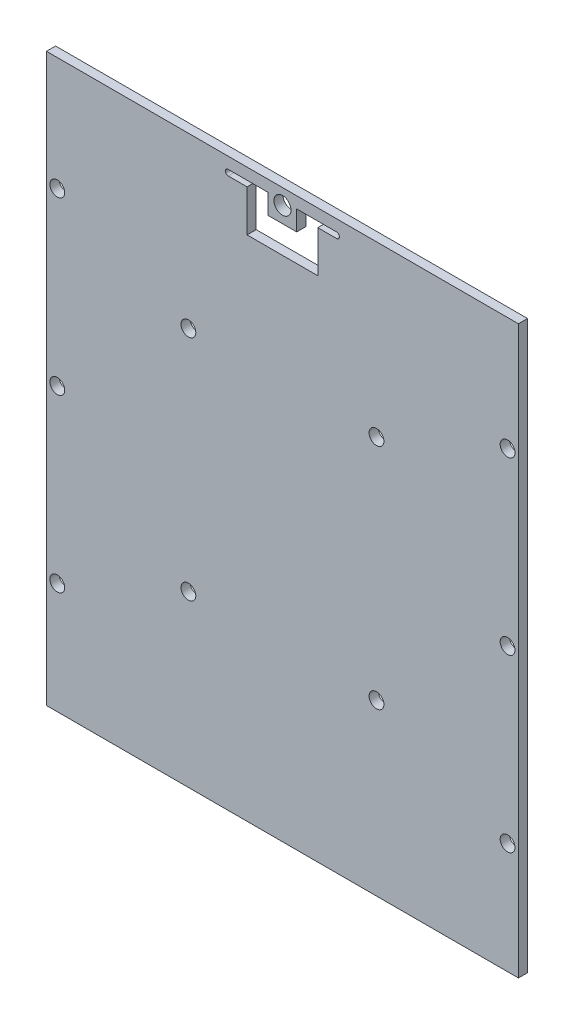
ISO-10303-21;
HEADER;
FILE_DESCRIPTION(('STEP AP214'),'2;1');
FILE_NAME('part.step','',(''),(''),'','','');
FILE_SCHEMA(('AUTOMOTIVE_DESIGN { 1 0 10303 214 1 1 1 1 }'));
ENDSEC;
DATA;
#1=APPLICATION_CONTEXT('core data for automotive mechanical design processes');
#2=APPLICATION_PROTOCOL_DEFINITION('international standard','automotive_design',2000,#1);
#3=PRODUCT_CONTEXT('',#1,'mechanical');
#4=PRODUCT('Part','Part','',(#3));
#5=PRODUCT_RELATED_PRODUCT_CATEGORY('part','',(#4));
#6=PRODUCT_DEFINITION_FORMATION('','',#4);
#7=PRODUCT_DEFINITION_CONTEXT('part definition',#1,'design');
#8=PRODUCT_DEFINITION('design','',#6,#7);
#9=PRODUCT_DEFINITION_SHAPE('','',#8);
#10=(LENGTH_UNIT() NAMED_UNIT(*) SI_UNIT(.MILLI.,.METRE.));
#11=(NAMED_UNIT(*) PLANE_ANGLE_UNIT() SI_UNIT($,.RADIAN.));
#12=(NAMED_UNIT(*) SI_UNIT($,.STERADIAN.) SOLID_ANGLE_UNIT());
#13=UNCERTAINTY_MEASURE_WITH_UNIT(LENGTH_MEASURE(1.E-05),#10,'distance_accuracy_value','');
#14=(GEOMETRIC_REPRESENTATION_CONTEXT(3) GLOBAL_UNCERTAINTY_ASSIGNED_CONTEXT((#13)) GLOBAL_UNIT_ASSIGNED_CONTEXT((#10,
#11,#12)) REPRESENTATION_CONTEXT('',''));
#15=CARTESIAN_POINT('',(0.,0.,0.));
#16=DIRECTION('',(0.,0.,1.));
#17=DIRECTION('',(1.,0.,0.));
#18=AXIS2_PLACEMENT_3D('',#15,#16,#17);
#19=CARTESIAN_POINT('',(0.,0.,1.6));
#20=DIRECTION('',(0.,0.,1.));
#21=DIRECTION('',(1.,0.,0.));
#22=AXIS2_PLACEMENT_3D('',#19,#20,#21);
#23=PLANE('',#22);
#24=CARTESIAN_POINT('',(-39.5,87.,1.6));
#25=DIRECTION('',(0.,0.,-1.));
#26=DIRECTION('',(-1.,0.,0.));
#27=AXIS2_PLACEMENT_3D('',#24,#25,#26);
#28=CIRCLE('',#27,1.3);
#29=CARTESIAN_POINT('',(-40.8,87.,1.6));
#30=VERTEX_POINT('',#29);
#31=EDGE_CURVE('E330',#30,#30,#28,.T.);
#32=ORIENTED_EDGE('',*,*,#31,.T.);
#33=EDGE_LOOP('',(#32));
#34=FACE_BOUND('',#33,.T.);
#35=CARTESIAN_POINT('',(39.5,87.,1.6));
#36=DIRECTION('',(0.,0.,-1.));
#37=DIRECTION('',(-1.,0.,0.));
#38=AXIS2_PLACEMENT_3D('',#35,#36,#37);
#39=CIRCLE('',#38,1.3);
#40=CARTESIAN_POINT('',(38.2,87.,1.6));
#41=VERTEX_POINT('',#40);
#42=EDGE_CURVE('E324',#41,#41,#39,.T.);
#43=ORIENTED_EDGE('',*,*,#42,.T.);
#44=EDGE_LOOP('',(#43));
#45=FACE_BOUND('',#44,.T.);
#46=DIRECTION('',(1.,0.,0.));
#47=VECTOR('',#46,1.);
#48=CARTESIAN_POINT('',(-6.2,96.6,1.6));
#49=LINE('',#48,#47);
#50=CARTESIAN_POINT('',(-6.2,96.6,1.6));
#51=VERTEX_POINT('',#50);
#52=CARTESIAN_POINT('',(6.2,96.6,1.6));
#53=VERTEX_POINT('',#52);
#54=EDGE_CURVE('E60',#51,#53,#49,.T.);
#55=ORIENTED_EDGE('',*,*,#54,.F.);
#56=DIRECTION('',(0.,-1.,0.));
#57=VECTOR('',#56,1.);
#58=CARTESIAN_POINT('',(-6.2,101.4,1.6));
#59=LINE('',#58,#57);
#60=CARTESIAN_POINT('',(-6.2,103.9,1.6));
#61=VERTEX_POINT('',#60);
#62=EDGE_CURVE('E216',#61,#51,#59,.T.);
#63=ORIENTED_EDGE('',*,*,#62,.F.);
#64=DIRECTION('',(1.,0.,0.));
#65=VECTOR('',#64,1.);
#66=CARTESIAN_POINT('',(-6.2,103.9,1.6));
#67=LINE('',#66,#65);
#68=CARTESIAN_POINT('',(-9.5,103.9,1.6));
#69=VERTEX_POINT('',#68);
#70=EDGE_CURVE('E219',#69,#61,#67,.T.);
#71=ORIENTED_EDGE('',*,*,#70,.F.);
#72=CARTESIAN_POINT('',(-9.5,104.4,1.6));
#73=DIRECTION('',(0.,0.,1.));
#74=DIRECTION('',(1.,0.,0.));
#75=AXIS2_PLACEMENT_3D('',#72,#73,#74);
#76=CIRCLE('',#75,0.5);
#77=CARTESIAN_POINT('',(-9.5,104.9,1.6));
#78=VERTEX_POINT('',#77);
#79=EDGE_CURVE('E222',#78,#69,#76,.T.);
#80=ORIENTED_EDGE('',*,*,#79,.F.);
#81=DIRECTION('',(-1.,0.,0.));
#82=VECTOR('',#81,1.);
#83=CARTESIAN_POINT('',(-9.5,104.9,1.6));
#84=LINE('',#83,#82);
#85=CARTESIAN_POINT('',(-2.5,104.9,1.6));
#86=VERTEX_POINT('',#85);
#87=EDGE_CURVE('E225',#86,#78,#84,.T.);
#88=ORIENTED_EDGE('',*,*,#87,.F.);
#89=DIRECTION('',(0.,1.,0.));
#90=VECTOR('',#89,1.);
#91=CARTESIAN_POINT('',(-2.5,104.9,1.6));
#92=LINE('',#91,#90);
#93=CARTESIAN_POINT('',(-2.5,101.4,1.6));
#94=VERTEX_POINT('',#93);
#95=EDGE_CURVE('E228',#94,#86,#92,.T.);
#96=ORIENTED_EDGE('',*,*,#95,.F.);
#97=DIRECTION('',(-1.,0.,0.));
#98=VECTOR('',#97,1.);
#99=CARTESIAN_POINT('',(-2.5,101.4,1.6));
#100=LINE('',#99,#98);
#101=CARTESIAN_POINT('',(2.5,101.4,1.6));
#102=VERTEX_POINT('',#101);
#103=EDGE_CURVE('E231',#102,#94,#100,.T.);
#104=ORIENTED_EDGE('',*,*,#103,.F.);
#105=DIRECTION('',(0.,-1.,0.));
#106=VECTOR('',#105,1.);
#107=CARTESIAN_POINT('',(2.5,101.4,1.6));
#108=LINE('',#107,#106);
#109=CARTESIAN_POINT('',(2.5,104.9,1.6));
#110=VERTEX_POINT('',#109);
#111=EDGE_CURVE('E234',#110,#102,#108,.T.);
#112=ORIENTED_EDGE('',*,*,#111,.F.);
#113=DIRECTION('',(-1.,0.,0.));
#114=VECTOR('',#113,1.);
#115=CARTESIAN_POINT('',(2.5,104.9,1.6));
#116=LINE('',#115,#114);
#117=CARTESIAN_POINT('',(9.5,104.9,1.6));
#118=VERTEX_POINT('',#117);
#119=EDGE_CURVE('E237',#118,#110,#116,.T.);
#120=ORIENTED_EDGE('',*,*,#119,.F.);
#121=CARTESIAN_POINT('',(9.5,104.4,1.6));
#122=DIRECTION('',(0.,0.,1.));
#123=DIRECTION('',(1.,0.,0.));
#124=AXIS2_PLACEMENT_3D('',#121,#122,#123);
#125=CIRCLE('',#124,0.5);
#126=CARTESIAN_POINT('',(9.5,103.9,1.6));
#127=VERTEX_POINT('',#126);
#128=EDGE_CURVE('E240',#127,#118,#125,.T.);
#129=ORIENTED_EDGE('',*,*,#128,.F.);
#130=DIRECTION('',(1.,0.,0.));
#131=VECTOR('',#130,1.);
#132=CARTESIAN_POINT('',(9.5,103.9,1.6));
#133=LINE('',#132,#131);
#134=CARTESIAN_POINT('',(6.2,103.9,1.6));
#135=VERTEX_POINT('',#134);
#136=EDGE_CURVE('E243',#135,#127,#133,.T.);
#137=ORIENTED_EDGE('',*,*,#136,.F.);
#138=DIRECTION('',(0.,1.,0.));
#139=VECTOR('',#138,1.);
#140=CARTESIAN_POINT('',(6.2,103.9,1.6));
#141=LINE('',#140,#139);
#142=EDGE_CURVE('E246',#53,#135,#141,.T.);
#143=ORIENTED_EDGE('',*,*,#142,.F.);
#144=EDGE_LOOP('',(#55,#63,#71,#80,#88,#96,#104,#112,#120,#129,#137,#143));
#145=FACE_BOUND('',#144,.T.);
#146=CARTESIAN_POINT('',(0.,104.2,1.6));
#147=DIRECTION('',(0.,0.,1.));
#148=DIRECTION('',(1.,0.,0.));
#149=AXIS2_PLACEMENT_3D('',#146,#147,#148);
#150=CIRCLE('',#149,1.5);
#151=CARTESIAN_POINT('',(1.5,104.2,1.6));
#152=VERTEX_POINT('',#151);
#153=EDGE_CURVE('E271',#152,#152,#150,.T.);
#154=ORIENTED_EDGE('',*,*,#153,.F.);
#155=EDGE_LOOP('',(#154));
#156=FACE_BOUND('',#155,.T.);
#157=DIRECTION('',(-1.,0.,0.));
#158=VECTOR('',#157,1.);
#159=CARTESIAN_POINT('',(0.,7.49999999999998,1.6));
#160=LINE('',#159,#158);
#161=CARTESIAN_POINT('',(41.4,7.49999999999998,1.6));
#162=VERTEX_POINT('',#161);
#163=CARTESIAN_POINT('',(-41.4,7.49999999999998,1.6));
#164=VERTEX_POINT('',#163);
#165=EDGE_CURVE('E274',#162,#164,#160,.T.);
#166=ORIENTED_EDGE('',*,*,#165,.F.);
#167=DIRECTION('',(0.,-1.,0.));
#168=VECTOR('',#167,1.);
#169=CARTESIAN_POINT('',(41.4,0.,1.6));
#170=LINE('',#169,#168);
#171=CARTESIAN_POINT('',(41.4,106.9,1.6));
#172=VERTEX_POINT('',#171);
#173=EDGE_CURVE('E164',#172,#162,#170,.T.);
#174=ORIENTED_EDGE('',*,*,#173,.F.);
#175=DIRECTION('',(1.,0.,0.));
#176=VECTOR('',#175,1.);
#177=CARTESIAN_POINT('',(0.,106.9,1.6));
#178=LINE('',#177,#176);
#179=CARTESIAN_POINT('',(-41.4,106.9,1.6));
#180=VERTEX_POINT('',#179);
#181=EDGE_CURVE('E170',#180,#172,#178,.T.);
#182=ORIENTED_EDGE('',*,*,#181,.F.);
#183=DIRECTION('',(0.,-1.,0.));
#184=VECTOR('',#183,1.);
#185=CARTESIAN_POINT('',(-41.4,0.,1.6));
#186=LINE('',#185,#184);
#187=EDGE_CURVE('E174',#180,#164,#186,.T.);
#188=ORIENTED_EDGE('',*,*,#187,.T.);
#189=EDGE_LOOP('',(#166,#174,#182,#188));
#190=FACE_BOUND('',#189,.T.);
#191=CARTESIAN_POINT('',(-16.5,37.25,1.6));
#192=DIRECTION('',(0.,0.,-1.));
#193=DIRECTION('',(-1.,0.,0.));
#194=AXIS2_PLACEMENT_3D('',#191,#192,#193);
#195=CIRCLE('',#194,1.3);
#196=CARTESIAN_POINT('',(-17.8,37.25,1.6));
#197=VERTEX_POINT('',#196);
#198=EDGE_CURVE('E156',#197,#197,#195,.T.);
#199=ORIENTED_EDGE('',*,*,#198,.T.);
#200=EDGE_LOOP('',(#199));
#201=FACE_BOUND('',#200,.T.);
#202=CARTESIAN_POINT('',(16.5,37.25,1.6));
#203=DIRECTION('',(0.,0.,-1.));
#204=DIRECTION('',(-1.,0.,0.));
#205=AXIS2_PLACEMENT_3D('',#202,#203,#204);
#206=CIRCLE('',#205,1.3);
#207=CARTESIAN_POINT('',(15.2,37.25,1.6));
#208=VERTEX_POINT('',#207);
#209=EDGE_CURVE('E282',#208,#208,#206,.T.);
#210=ORIENTED_EDGE('',*,*,#209,.T.);
#211=EDGE_LOOP('',(#210));
#212=FACE_BOUND('',#211,.T.);
#213=CARTESIAN_POINT('',(16.5,77.25,1.6));
#214=DIRECTION('',(0.,0.,-1.));
#215=DIRECTION('',(-1.,0.,0.));
#216=AXIS2_PLACEMENT_3D('',#213,#214,#215);
#217=CIRCLE('',#216,1.3);
#218=CARTESIAN_POINT('',(15.2,77.25,1.6));
#219=VERTEX_POINT('',#218);
#220=EDGE_CURVE('E288',#219,#219,#217,.T.);
#221=ORIENTED_EDGE('',*,*,#220,.T.);
#222=EDGE_LOOP('',(#221));
#223=FACE_BOUND('',#222,.T.);
#224=CARTESIAN_POINT('',(-16.5,77.25,1.6));
#225=DIRECTION('',(0.,0.,-1.));
#226=DIRECTION('',(-1.,0.,0.));
#227=AXIS2_PLACEMENT_3D('',#224,#225,#226);
#228=CIRCLE('',#227,1.3);
#229=CARTESIAN_POINT('',(-17.8,77.25,1.6));
#230=VERTEX_POINT('',#229);
#231=EDGE_CURVE('E294',#230,#230,#228,.T.);
#232=ORIENTED_EDGE('',*,*,#231,.T.);
#233=EDGE_LOOP('',(#232));
#234=FACE_BOUND('',#233,.T.);
#235=CARTESIAN_POINT('',(39.5,27.,1.6));
#236=DIRECTION('',(0.,0.,-1.));
#237=DIRECTION('',(-1.,0.,0.));
#238=AXIS2_PLACEMENT_3D('',#235,#236,#237);
#239=CIRCLE('',#238,1.3);
#240=CARTESIAN_POINT('',(38.2,27.,1.6));
#241=VERTEX_POINT('',#240);
#242=EDGE_CURVE('E300',#241,#241,#239,.T.);
#243=ORIENTED_EDGE('',*,*,#242,.T.);
#244=EDGE_LOOP('',(#243));
#245=FACE_BOUND('',#244,.T.);
#246=CARTESIAN_POINT('',(-39.5,27.,1.6));
#247=DIRECTION('',(0.,0.,-1.));
#248=DIRECTION('',(-1.,0.,0.));
#249=AXIS2_PLACEMENT_3D('',#246,#247,#248);
#250=CIRCLE('',#249,1.3);
#251=CARTESIAN_POINT('',(-40.8,27.,1.6));
#252=VERTEX_POINT('',#251);
#253=EDGE_CURVE('E306',#252,#252,#250,.T.);
#254=ORIENTED_EDGE('',*,*,#253,.T.);
#255=EDGE_LOOP('',(#254));
#256=FACE_BOUND('',#255,.T.);
#257=CARTESIAN_POINT('',(39.5,57.,1.6));
#258=DIRECTION('',(0.,0.,-1.));
#259=DIRECTION('',(-1.,0.,0.));
#260=AXIS2_PLACEMENT_3D('',#257,#258,#259);
#261=CIRCLE('',#260,1.3);
#262=CARTESIAN_POINT('',(38.2,57.,1.6));
#263=VERTEX_POINT('',#262);
#264=EDGE_CURVE('E312',#263,#263,#261,.T.);
#265=ORIENTED_EDGE('',*,*,#264,.T.);
#266=EDGE_LOOP('',(#265));
#267=FACE_BOUND('',#266,.T.);
#268=CARTESIAN_POINT('',(-39.5,57.,1.6));
#269=DIRECTION('',(0.,0.,-1.));
#270=DIRECTION('',(-1.,0.,0.));
#271=AXIS2_PLACEMENT_3D('',#268,#269,#270);
#272=CIRCLE('',#271,1.3);
#273=CARTESIAN_POINT('',(-40.8,57.,1.6));
#274=VERTEX_POINT('',#273);
#275=EDGE_CURVE('E318',#274,#274,#272,.T.);
#276=ORIENTED_EDGE('',*,*,#275,.T.);
#277=EDGE_LOOP('',(#276));
#278=FACE_BOUND('',#277,.T.);
#279=ADVANCED_FACE('F37',(#34,#45,#145,#156,#190,#201,#212,#223,#234,#245,#256,#267,#278),#23,.T.);
#280=CARTESIAN_POINT('',(0.,106.9,1.6));
#281=DIRECTION('',(0.,1.,0.));
#282=DIRECTION('',(0.,0.,1.));
#283=AXIS2_PLACEMENT_3D('',#280,#281,#282);
#284=PLANE('',#283);
#285=DIRECTION('',(1.,0.,0.));
#286=VECTOR('',#285,1.);
#287=CARTESIAN_POINT('',(0.,106.9,0.));
#288=LINE('',#287,#286);
#289=CARTESIAN_POINT('',(-41.4,106.9,0.));
#290=VERTEX_POINT('',#289);
#291=CARTESIAN_POINT('',(41.4,106.9,0.));
#292=VERTEX_POINT('',#291);
#293=EDGE_CURVE('E169',#290,#292,#288,.T.);
#294=ORIENTED_EDGE('',*,*,#293,.F.);
#295=DIRECTION('',(0.,0.,-1.));
#296=VECTOR('',#295,1.);
#297=CARTESIAN_POINT('',(-41.4,106.9,1.6));
#298=LINE('',#297,#296);
#299=EDGE_CURVE('E11',#180,#290,#298,.T.);
#300=ORIENTED_EDGE('',*,*,#299,.F.);
#301=ORIENTED_EDGE('',*,*,#181,.T.);
#302=DIRECTION('',(0.,0.,-1.));
#303=VECTOR('',#302,1.);
#304=CARTESIAN_POINT('',(41.4,106.9,1.6));
#305=LINE('',#304,#303);
#306=EDGE_CURVE('E45',#172,#292,#305,.T.);
#307=ORIENTED_EDGE('',*,*,#306,.T.);
#308=EDGE_LOOP('',(#294,#300,#301,#307));
#309=FACE_BOUND('',#308,.T.);
#310=ADVANCED_FACE('F39',(#309),#284,.T.);
#311=CARTESIAN_POINT('',(-41.4,0.,1.6));
#312=DIRECTION('',(1.,0.,0.));
#313=DIRECTION('',(0.,1.,0.));
#314=AXIS2_PLACEMENT_3D('',#311,#312,#313);
#315=PLANE('',#314);
#316=DIRECTION('',(0.,-1.,0.));
#317=VECTOR('',#316,1.);
#318=CARTESIAN_POINT('',(-41.4,0.,0.));
#319=LINE('',#318,#317);
#320=CARTESIAN_POINT('',(-41.4,7.49999999999998,0.));
#321=VERTEX_POINT('',#320);
#322=EDGE_CURVE('E171',#290,#321,#319,.T.);
#323=ORIENTED_EDGE('',*,*,#322,.T.);
#324=DIRECTION('',(0.,0.,1.));
#325=VECTOR('',#324,1.);
#326=CARTESIAN_POINT('',(-41.4,7.49999999999998,0.));
#327=LINE('',#326,#325);
#328=EDGE_CURVE('E52',#321,#164,#327,.T.);
#329=ORIENTED_EDGE('',*,*,#328,.T.);
#330=ORIENTED_EDGE('',*,*,#187,.F.);
#331=ORIENTED_EDGE('',*,*,#299,.T.);
#332=EDGE_LOOP('',(#323,#329,#330,#331));
#333=FACE_BOUND('',#332,.T.);
#334=ADVANCED_FACE('F396',(#333),#315,.F.);
#335=CARTESIAN_POINT('',(41.4,0.,1.6));
#336=DIRECTION('',(1.,0.,0.));
#337=DIRECTION('',(0.,1.,0.));
#338=AXIS2_PLACEMENT_3D('',#335,#336,#337);
#339=PLANE('',#338);
#340=DIRECTION('',(0.,0.,1.));
#341=VECTOR('',#340,1.);
#342=CARTESIAN_POINT('',(41.4,7.49999999999998,0.));
#343=LINE('',#342,#341);
#344=CARTESIAN_POINT('',(41.4,7.49999999999998,0.));
#345=VERTEX_POINT('',#344);
#346=EDGE_CURVE('E150',#345,#162,#343,.T.);
#347=ORIENTED_EDGE('',*,*,#346,.F.);
#348=DIRECTION('',(0.,-1.,0.));
#349=VECTOR('',#348,1.);
#350=CARTESIAN_POINT('',(41.4,0.,0.));
#351=LINE('',#350,#349);
#352=EDGE_CURVE('E162',#292,#345,#351,.T.);
#353=ORIENTED_EDGE('',*,*,#352,.F.);
#354=ORIENTED_EDGE('',*,*,#306,.F.);
#355=ORIENTED_EDGE('',*,*,#173,.T.);
#356=EDGE_LOOP('',(#347,#353,#354,#355));
#357=FACE_BOUND('',#356,.T.);
#358=ADVANCED_FACE('F161',(#357),#339,.T.);
#359=CARTESIAN_POINT('',(0.,0.,0.));
#360=DIRECTION('',(0.,0.,1.));
#361=DIRECTION('',(1.,0.,0.));
#362=AXIS2_PLACEMENT_3D('',#359,#360,#361);
#363=PLANE('',#362);
#364=CARTESIAN_POINT('',(-39.5,87.,0.));
#365=DIRECTION('',(0.,0.,-1.));
#366=DIRECTION('',(-1.,0.,0.));
#367=AXIS2_PLACEMENT_3D('',#364,#365,#366);
#368=CIRCLE('',#367,1.3);
#369=CARTESIAN_POINT('',(-40.8,87.,0.));
#370=VERTEX_POINT('',#369);
#371=EDGE_CURVE('E333',#370,#370,#368,.T.);
#372=ORIENTED_EDGE('',*,*,#371,.F.);
#373=EDGE_LOOP('',(#372));
#374=FACE_BOUND('',#373,.T.);
#375=CARTESIAN_POINT('',(39.5,87.,0.));
#376=DIRECTION('',(0.,0.,-1.));
#377=DIRECTION('',(-1.,0.,0.));
#378=AXIS2_PLACEMENT_3D('',#375,#376,#377);
#379=CIRCLE('',#378,1.3);
#380=CARTESIAN_POINT('',(38.2,87.,0.));
#381=VERTEX_POINT('',#380);
#382=EDGE_CURVE('E327',#381,#381,#379,.T.);
#383=ORIENTED_EDGE('',*,*,#382,.F.);
#384=EDGE_LOOP('',(#383));
#385=FACE_BOUND('',#384,.T.);
#386=CARTESIAN_POINT('',(-39.5,57.,0.));
#387=DIRECTION('',(0.,0.,-1.));
#388=DIRECTION('',(-1.,0.,0.));
#389=AXIS2_PLACEMENT_3D('',#386,#387,#388);
#390=CIRCLE('',#389,1.3);
#391=CARTESIAN_POINT('',(-40.8,57.,0.));
#392=VERTEX_POINT('',#391);
#393=EDGE_CURVE('E321',#392,#392,#390,.T.);
#394=ORIENTED_EDGE('',*,*,#393,.F.);
#395=EDGE_LOOP('',(#394));
#396=FACE_BOUND('',#395,.T.);
#397=CARTESIAN_POINT('',(39.5,57.,0.));
#398=DIRECTION('',(0.,0.,-1.));
#399=DIRECTION('',(-1.,0.,0.));
#400=AXIS2_PLACEMENT_3D('',#397,#398,#399);
#401=CIRCLE('',#400,1.3);
#402=CARTESIAN_POINT('',(38.2,57.,0.));
#403=VERTEX_POINT('',#402);
#404=EDGE_CURVE('E315',#403,#403,#401,.T.);
#405=ORIENTED_EDGE('',*,*,#404,.F.);
#406=EDGE_LOOP('',(#405));
#407=FACE_BOUND('',#406,.T.);
#408=CARTESIAN_POINT('',(-39.5,27.,0.));
#409=DIRECTION('',(0.,0.,-1.));
#410=DIRECTION('',(-1.,0.,0.));
#411=AXIS2_PLACEMENT_3D('',#408,#409,#410);
#412=CIRCLE('',#411,1.3);
#413=CARTESIAN_POINT('',(-40.8,27.,0.));
#414=VERTEX_POINT('',#413);
#415=EDGE_CURVE('E309',#414,#414,#412,.T.);
#416=ORIENTED_EDGE('',*,*,#415,.F.);
#417=EDGE_LOOP('',(#416));
#418=FACE_BOUND('',#417,.T.);
#419=CARTESIAN_POINT('',(39.5,27.,0.));
#420=DIRECTION('',(0.,0.,-1.));
#421=DIRECTION('',(-1.,0.,0.));
#422=AXIS2_PLACEMENT_3D('',#419,#420,#421);
#423=CIRCLE('',#422,1.3);
#424=CARTESIAN_POINT('',(38.2,27.,0.));
#425=VERTEX_POINT('',#424);
#426=EDGE_CURVE('E303',#425,#425,#423,.T.);
#427=ORIENTED_EDGE('',*,*,#426,.F.);
#428=EDGE_LOOP('',(#427));
#429=FACE_BOUND('',#428,.T.);
#430=CARTESIAN_POINT('',(-16.5,77.25,0.));
#431=DIRECTION('',(0.,0.,-1.));
#432=DIRECTION('',(-1.,0.,0.));
#433=AXIS2_PLACEMENT_3D('',#430,#431,#432);
#434=CIRCLE('',#433,1.3);
#435=CARTESIAN_POINT('',(-17.8,77.25,0.));
#436=VERTEX_POINT('',#435);
#437=EDGE_CURVE('E297',#436,#436,#434,.T.);
#438=ORIENTED_EDGE('',*,*,#437,.F.);
#439=EDGE_LOOP('',(#438));
#440=FACE_BOUND('',#439,.T.);
#441=CARTESIAN_POINT('',(16.5,77.25,0.));
#442=DIRECTION('',(0.,0.,-1.));
#443=DIRECTION('',(-1.,0.,0.));
#444=AXIS2_PLACEMENT_3D('',#441,#442,#443);
#445=CIRCLE('',#444,1.3);
#446=CARTESIAN_POINT('',(15.2,77.25,0.));
#447=VERTEX_POINT('',#446);
#448=EDGE_CURVE('E291',#447,#447,#445,.T.);
#449=ORIENTED_EDGE('',*,*,#448,.F.);
#450=EDGE_LOOP('',(#449));
#451=FACE_BOUND('',#450,.T.);
#452=CARTESIAN_POINT('',(16.5,37.25,0.));
#453=DIRECTION('',(0.,0.,-1.));
#454=DIRECTION('',(-1.,0.,0.));
#455=AXIS2_PLACEMENT_3D('',#452,#453,#454);
#456=CIRCLE('',#455,1.3);
#457=CARTESIAN_POINT('',(15.2,37.25,0.));
#458=VERTEX_POINT('',#457);
#459=EDGE_CURVE('E285',#458,#458,#456,.T.);
#460=ORIENTED_EDGE('',*,*,#459,.F.);
#461=EDGE_LOOP('',(#460));
#462=FACE_BOUND('',#461,.T.);
#463=CARTESIAN_POINT('',(-16.5,37.25,0.));
#464=DIRECTION('',(0.,0.,-1.));
#465=DIRECTION('',(-1.,0.,0.));
#466=AXIS2_PLACEMENT_3D('',#463,#464,#465);
#467=CIRCLE('',#466,1.3);
#468=CARTESIAN_POINT('',(-17.8,37.25,0.));
#469=VERTEX_POINT('',#468);
#470=EDGE_CURVE('E279',#469,#469,#467,.T.);
#471=ORIENTED_EDGE('',*,*,#470,.F.);
#472=EDGE_LOOP('',(#471));
#473=FACE_BOUND('',#472,.T.);
#474=CARTESIAN_POINT('',(0.,104.2,0.));
#475=DIRECTION('',(0.,0.,1.));
#476=DIRECTION('',(1.,0.,0.));
#477=AXIS2_PLACEMENT_3D('',#474,#475,#476);
#478=CIRCLE('',#477,1.5);
#479=CARTESIAN_POINT('',(1.5,104.2,0.));
#480=VERTEX_POINT('',#479);
#481=EDGE_CURVE('E248',#480,#480,#478,.F.);
#482=ORIENTED_EDGE('',*,*,#481,.F.);
#483=EDGE_LOOP('',(#482));
#484=FACE_BOUND('',#483,.T.);
#485=DIRECTION('',(0.,1.,0.));
#486=VECTOR('',#485,1.);
#487=CARTESIAN_POINT('',(-6.2,101.4,0.));
#488=LINE('',#487,#486);
#489=CARTESIAN_POINT('',(-6.2,96.6,0.));
#490=VERTEX_POINT('',#489);
#491=CARTESIAN_POINT('',(-6.2,103.9,0.));
#492=VERTEX_POINT('',#491);
#493=EDGE_CURVE('E187',#490,#492,#488,.T.);
#494=ORIENTED_EDGE('',*,*,#493,.F.);
#495=DIRECTION('',(-1.,0.,0.));
#496=VECTOR('',#495,1.);
#497=CARTESIAN_POINT('',(-6.2,96.6,0.));
#498=LINE('',#497,#496);
#499=CARTESIAN_POINT('',(6.2,96.6,0.));
#500=VERTEX_POINT('',#499);
#501=EDGE_CURVE('E183',#500,#490,#498,.T.);
#502=ORIENTED_EDGE('',*,*,#501,.F.);
#503=DIRECTION('',(0.,-1.,0.));
#504=VECTOR('',#503,1.);
#505=CARTESIAN_POINT('',(6.2,103.9,0.));
#506=LINE('',#505,#504);
#507=CARTESIAN_POINT('',(6.2,103.9,0.));
#508=VERTEX_POINT('',#507);
#509=EDGE_CURVE('E182',#508,#500,#506,.T.);
#510=ORIENTED_EDGE('',*,*,#509,.F.);
#511=DIRECTION('',(-1.,0.,0.));
#512=VECTOR('',#511,1.);
#513=CARTESIAN_POINT('',(9.5,103.9,0.));
#514=LINE('',#513,#512);
#515=CARTESIAN_POINT('',(9.5,103.9,0.));
#516=VERTEX_POINT('',#515);
#517=EDGE_CURVE('E214',#516,#508,#514,.T.);
#518=ORIENTED_EDGE('',*,*,#517,.F.);
#519=CARTESIAN_POINT('',(9.5,104.4,0.));
#520=DIRECTION('',(0.,0.,1.));
#521=DIRECTION('',(1.,0.,0.));
#522=AXIS2_PLACEMENT_3D('',#519,#520,#521);
#523=CIRCLE('',#522,0.5);
#524=CARTESIAN_POINT('',(9.5,104.9,0.));
#525=VERTEX_POINT('',#524);
#526=EDGE_CURVE('E265',#525,#516,#523,.F.);
#527=ORIENTED_EDGE('',*,*,#526,.F.);
#528=DIRECTION('',(1.,0.,0.));
#529=VECTOR('',#528,1.);
#530=CARTESIAN_POINT('',(2.5,104.9,0.));
#531=LINE('',#530,#529);
#532=CARTESIAN_POINT('',(2.5,104.9,0.));
#533=VERTEX_POINT('',#532);
#534=EDGE_CURVE('E263',#533,#525,#531,.T.);
#535=ORIENTED_EDGE('',*,*,#534,.F.);
#536=DIRECTION('',(0.,1.,0.));
#537=VECTOR('',#536,1.);
#538=CARTESIAN_POINT('',(2.5,101.4,0.));
#539=LINE('',#538,#537);
#540=CARTESIAN_POINT('',(2.5,101.4,0.));
#541=VERTEX_POINT('',#540);
#542=EDGE_CURVE('E261',#541,#533,#539,.T.);
#543=ORIENTED_EDGE('',*,*,#542,.F.);
#544=DIRECTION('',(1.,0.,0.));
#545=VECTOR('',#544,1.);
#546=CARTESIAN_POINT('',(-2.5,101.4,0.));
#547=LINE('',#546,#545);
#548=CARTESIAN_POINT('',(-2.5,101.4,0.));
#549=VERTEX_POINT('',#548);
#550=EDGE_CURVE('E259',#549,#541,#547,.T.);
#551=ORIENTED_EDGE('',*,*,#550,.F.);
#552=DIRECTION('',(0.,-1.,0.));
#553=VECTOR('',#552,1.);
#554=CARTESIAN_POINT('',(-2.5,104.9,0.));
#555=LINE('',#554,#553);
#556=CARTESIAN_POINT('',(-2.5,104.9,0.));
#557=VERTEX_POINT('',#556);
#558=EDGE_CURVE('E257',#557,#549,#555,.T.);
#559=ORIENTED_EDGE('',*,*,#558,.F.);
#560=DIRECTION('',(1.,0.,0.));
#561=VECTOR('',#560,1.);
#562=CARTESIAN_POINT('',(-9.5,104.9,0.));
#563=LINE('',#562,#561);
#564=CARTESIAN_POINT('',(-9.5,104.9,0.));
#565=VERTEX_POINT('',#564);
#566=EDGE_CURVE('E255',#565,#557,#563,.T.);
#567=ORIENTED_EDGE('',*,*,#566,.F.);
#568=CARTESIAN_POINT('',(-9.5,104.4,0.));
#569=DIRECTION('',(0.,0.,1.));
#570=DIRECTION('',(1.,0.,0.));
#571=AXIS2_PLACEMENT_3D('',#568,#569,#570);
#572=CIRCLE('',#571,0.5);
#573=CARTESIAN_POINT('',(-9.5,103.9,0.));
#574=VERTEX_POINT('',#573);
#575=EDGE_CURVE('E253',#574,#565,#572,.F.);
#576=ORIENTED_EDGE('',*,*,#575,.F.);
#577=DIRECTION('',(-1.,0.,0.));
#578=VECTOR('',#577,1.);
#579=CARTESIAN_POINT('',(-6.2,103.9,0.));
#580=LINE('',#579,#578);
#581=EDGE_CURVE('E251',#492,#574,#580,.T.);
#582=ORIENTED_EDGE('',*,*,#581,.F.);
#583=EDGE_LOOP('',(#494,#502,#510,#518,#527,#535,#543,#551,#559,#567,#576,#582));
#584=FACE_BOUND('',#583,.T.);
#585=ORIENTED_EDGE('',*,*,#352,.T.);
#586=DIRECTION('',(-1.,0.,0.));
#587=VECTOR('',#586,1.);
#588=CARTESIAN_POINT('',(-41.4,7.49999999999998,0.));
#589=LINE('',#588,#587);
#590=EDGE_CURVE('E147',#345,#321,#589,.T.);
#591=ORIENTED_EDGE('',*,*,#590,.T.);
#592=ORIENTED_EDGE('',*,*,#322,.F.);
#593=ORIENTED_EDGE('',*,*,#293,.T.);
#594=EDGE_LOOP('',(#585,#591,#592,#593));
#595=FACE_BOUND('',#594,.T.);
#596=ADVANCED_FACE('F167',(#374,#385,#396,#407,#418,#429,#440,#451,#462,#473,#484,#584,#595),
#363,.F.);
#597=CARTESIAN_POINT('',(-6.2,96.6,-21.6538680147451));
#598=DIRECTION('',(0.,-1.,0.));
#599=DIRECTION('',(0.,0.,-1.));
#600=AXIS2_PLACEMENT_3D('',#597,#598,#599);
#601=PLANE('',#600);
#602=ORIENTED_EDGE('',*,*,#501,.T.);
#603=DIRECTION('',(0.,0.,1.));
#604=VECTOR('',#603,1.);
#605=CARTESIAN_POINT('',(-6.2,96.6,-21.6538680147451));
#606=LINE('',#605,#604);
#607=EDGE_CURVE('E210',#490,#51,#606,.T.);
#608=ORIENTED_EDGE('',*,*,#607,.T.);
#609=ORIENTED_EDGE('',*,*,#54,.T.);
#610=DIRECTION('',(0.,0.,1.));
#611=VECTOR('',#610,1.);
#612=CARTESIAN_POINT('',(6.2,96.6,-21.6538680147451));
#613=LINE('',#612,#611);
#614=EDGE_CURVE('E212',#500,#53,#613,.T.);
#615=ORIENTED_EDGE('',*,*,#614,.F.);
#616=EDGE_LOOP('',(#602,#608,#609,#615));
#617=FACE_BOUND('',#616,.T.);
#618=ADVANCED_FACE('F341',(#617),#601,.F.);
#619=CARTESIAN_POINT('',(-6.2,101.4,-21.6538680147451));
#620=DIRECTION('',(-1.,0.,0.));
#621=DIRECTION('',(0.,-1.,0.));
#622=AXIS2_PLACEMENT_3D('',#619,#620,#621);
#623=PLANE('',#622);
#624=ORIENTED_EDGE('',*,*,#493,.T.);
#625=DIRECTION('',(0.,0.,1.));
#626=VECTOR('',#625,1.);
#627=CARTESIAN_POINT('',(-6.2,103.9,-21.6538680147451));
#628=LINE('',#627,#626);
#629=EDGE_CURVE('E208',#492,#61,#628,.T.);
#630=ORIENTED_EDGE('',*,*,#629,.T.);
#631=ORIENTED_EDGE('',*,*,#62,.T.);
#632=ORIENTED_EDGE('',*,*,#607,.F.);
#633=EDGE_LOOP('',(#624,#630,#631,#632));
#634=FACE_BOUND('',#633,.T.);
#635=ADVANCED_FACE('F370',(#634),#623,.F.);
#636=CARTESIAN_POINT('',(-6.2,103.9,-21.6538680147451));
#637=DIRECTION('',(0.,-1.,0.));
#638=DIRECTION('',(0.,0.,-1.));
#639=AXIS2_PLACEMENT_3D('',#636,#637,#638);
#640=PLANE('',#639);
#641=ORIENTED_EDGE('',*,*,#581,.T.);
#642=DIRECTION('',(0.,0.,1.));
#643=VECTOR('',#642,1.);
#644=CARTESIAN_POINT('',(-9.5,103.9,-21.6538680147451));
#645=LINE('',#644,#643);
#646=EDGE_CURVE('E206',#574,#69,#645,.T.);
#647=ORIENTED_EDGE('',*,*,#646,.T.);
#648=ORIENTED_EDGE('',*,*,#70,.T.);
#649=ORIENTED_EDGE('',*,*,#629,.F.);
#650=EDGE_LOOP('',(#641,#647,#648,#649));
#651=FACE_BOUND('',#650,.T.);
#652=ADVANCED_FACE('F372',(#651),#640,.F.);
#653=CARTESIAN_POINT('',(-9.5,104.4,-21.6538680147451));
#654=DIRECTION('',(0.,0.,1.));
#655=DIRECTION('',(1.,0.,0.));
#656=AXIS2_PLACEMENT_3D('',#653,#654,#655);
#657=CYLINDRICAL_SURFACE('',#656,0.5);
#658=ORIENTED_EDGE('',*,*,#575,.T.);
#659=DIRECTION('',(0.,0.,1.));
#660=VECTOR('',#659,1.);
#661=CARTESIAN_POINT('',(-9.5,104.9,-21.6538680147451));
#662=LINE('',#661,#660);
#663=EDGE_CURVE('E204',#565,#78,#662,.T.);
#664=ORIENTED_EDGE('',*,*,#663,.T.);
#665=ORIENTED_EDGE('',*,*,#79,.T.);
#666=ORIENTED_EDGE('',*,*,#646,.F.);
#667=EDGE_LOOP('',(#658,#664,#665,#666));
#668=FACE_BOUND('',#667,.T.);
#669=ADVANCED_FACE('F506',(#668),#657,.F.);
#670=CARTESIAN_POINT('',(-9.5,104.9,-21.6538680147451));
#671=DIRECTION('',(0.,1.,0.));
#672=DIRECTION('',(0.,0.,1.));
#673=AXIS2_PLACEMENT_3D('',#670,#671,#672);
#674=PLANE('',#673);
#675=ORIENTED_EDGE('',*,*,#566,.T.);
#676=DIRECTION('',(0.,0.,1.));
#677=VECTOR('',#676,1.);
#678=CARTESIAN_POINT('',(-2.5,104.9,-21.6538680147451));
#679=LINE('',#678,#677);
#680=EDGE_CURVE('E202',#557,#86,#679,.T.);
#681=ORIENTED_EDGE('',*,*,#680,.T.);
#682=ORIENTED_EDGE('',*,*,#87,.T.);
#683=ORIENTED_EDGE('',*,*,#663,.F.);
#684=EDGE_LOOP('',(#675,#681,#682,#683));
#685=FACE_BOUND('',#684,.T.);
#686=ADVANCED_FACE('F502',(#685),#674,.F.);
#687=CARTESIAN_POINT('',(-2.5,104.9,-21.6538680147451));
#688=DIRECTION('',(1.,0.,0.));
#689=DIRECTION('',(0.,1.,0.));
#690=AXIS2_PLACEMENT_3D('',#687,#688,#689);
#691=PLANE('',#690);
#692=ORIENTED_EDGE('',*,*,#558,.T.);
#693=DIRECTION('',(0.,0.,1.));
#694=VECTOR('',#693,1.);
#695=CARTESIAN_POINT('',(-2.5,101.4,-21.6538680147451));
#696=LINE('',#695,#694);
#697=EDGE_CURVE('E200',#549,#94,#696,.T.);
#698=ORIENTED_EDGE('',*,*,#697,.T.);
#699=ORIENTED_EDGE('',*,*,#95,.T.);
#700=ORIENTED_EDGE('',*,*,#680,.F.);
#701=EDGE_LOOP('',(#692,#698,#699,#700));
#702=FACE_BOUND('',#701,.T.);
#703=ADVANCED_FACE('F498',(#702),#691,.F.);
#704=CARTESIAN_POINT('',(-2.5,101.4,-21.6538680147451));
#705=DIRECTION('',(0.,1.,0.));
#706=DIRECTION('',(0.,0.,1.));
#707=AXIS2_PLACEMENT_3D('',#704,#705,#706);
#708=PLANE('',#707);
#709=ORIENTED_EDGE('',*,*,#550,.T.);
#710=DIRECTION('',(0.,0.,1.));
#711=VECTOR('',#710,1.);
#712=CARTESIAN_POINT('',(2.5,101.4,-21.6538680147451));
#713=LINE('',#712,#711);
#714=EDGE_CURVE('E198',#541,#102,#713,.T.);
#715=ORIENTED_EDGE('',*,*,#714,.T.);
#716=ORIENTED_EDGE('',*,*,#103,.T.);
#717=ORIENTED_EDGE('',*,*,#697,.F.);
#718=EDGE_LOOP('',(#709,#715,#716,#717));
#719=FACE_BOUND('',#718,.T.);
#720=ADVANCED_FACE('F494',(#719),#708,.F.);
#721=CARTESIAN_POINT('',(2.5,101.4,-21.6538680147451));
#722=DIRECTION('',(-1.,0.,0.));
#723=DIRECTION('',(0.,-1.,0.));
#724=AXIS2_PLACEMENT_3D('',#721,#722,#723);
#725=PLANE('',#724);
#726=ORIENTED_EDGE('',*,*,#542,.T.);
#727=DIRECTION('',(0.,0.,1.));
#728=VECTOR('',#727,1.);
#729=CARTESIAN_POINT('',(2.5,104.9,-21.6538680147451));
#730=LINE('',#729,#728);
#731=EDGE_CURVE('E196',#533,#110,#730,.T.);
#732=ORIENTED_EDGE('',*,*,#731,.T.);
#733=ORIENTED_EDGE('',*,*,#111,.T.);
#734=ORIENTED_EDGE('',*,*,#714,.F.);
#735=EDGE_LOOP('',(#726,#732,#733,#734));
#736=FACE_BOUND('',#735,.T.);
#737=ADVANCED_FACE('F490',(#736),#725,.F.);
#738=CARTESIAN_POINT('',(2.5,104.9,-21.6538680147451));
#739=DIRECTION('',(0.,1.,0.));
#740=DIRECTION('',(0.,0.,1.));
#741=AXIS2_PLACEMENT_3D('',#738,#739,#740);
#742=PLANE('',#741);
#743=ORIENTED_EDGE('',*,*,#534,.T.);
#744=DIRECTION('',(0.,0.,1.));
#745=VECTOR('',#744,1.);
#746=CARTESIAN_POINT('',(9.5,104.9,-21.6538680147451));
#747=LINE('',#746,#745);
#748=EDGE_CURVE('E194',#525,#118,#747,.T.);
#749=ORIENTED_EDGE('',*,*,#748,.T.);
#750=ORIENTED_EDGE('',*,*,#119,.T.);
#751=ORIENTED_EDGE('',*,*,#731,.F.);
#752=EDGE_LOOP('',(#743,#749,#750,#751));
#753=FACE_BOUND('',#752,.T.);
#754=ADVANCED_FACE('F484',(#753),#742,.F.);
#755=CARTESIAN_POINT('',(9.5,104.4,-21.6538680147451));
#756=DIRECTION('',(0.,0.,1.));
#757=DIRECTION('',(1.,0.,0.));
#758=AXIS2_PLACEMENT_3D('',#755,#756,#757);
#759=CYLINDRICAL_SURFACE('',#758,0.5);
#760=ORIENTED_EDGE('',*,*,#526,.T.);
#761=DIRECTION('',(0.,0.,1.));
#762=VECTOR('',#761,1.);
#763=CARTESIAN_POINT('',(9.5,103.9,-21.6538680147451));
#764=LINE('',#763,#762);
#765=EDGE_CURVE('E192',#516,#127,#764,.T.);
#766=ORIENTED_EDGE('',*,*,#765,.T.);
#767=ORIENTED_EDGE('',*,*,#128,.T.);
#768=ORIENTED_EDGE('',*,*,#748,.F.);
#769=EDGE_LOOP('',(#760,#766,#767,#768));
#770=FACE_BOUND('',#769,.T.);
#771=ADVANCED_FACE('F479',(#770),#759,.F.);
#772=CARTESIAN_POINT('',(9.5,103.9,-21.6538680147451));
#773=DIRECTION('',(0.,-1.,0.));
#774=DIRECTION('',(0.,0.,-1.));
#775=AXIS2_PLACEMENT_3D('',#772,#773,#774);
#776=PLANE('',#775);
#777=ORIENTED_EDGE('',*,*,#517,.T.);
#778=DIRECTION('',(0.,0.,1.));
#779=VECTOR('',#778,1.);
#780=CARTESIAN_POINT('',(6.2,103.9,-21.6538680147451));
#781=LINE('',#780,#779);
#782=EDGE_CURVE('E190',#508,#135,#781,.T.);
#783=ORIENTED_EDGE('',*,*,#782,.T.);
#784=ORIENTED_EDGE('',*,*,#136,.T.);
#785=ORIENTED_EDGE('',*,*,#765,.F.);
#786=EDGE_LOOP('',(#777,#783,#784,#785));
#787=FACE_BOUND('',#786,.T.);
#788=ADVANCED_FACE('F473',(#787),#776,.F.);
#789=CARTESIAN_POINT('',(6.2,103.9,-21.6538680147451));
#790=DIRECTION('',(1.,0.,0.));
#791=DIRECTION('',(0.,1.,0.));
#792=AXIS2_PLACEMENT_3D('',#789,#790,#791);
#793=PLANE('',#792);
#794=ORIENTED_EDGE('',*,*,#509,.T.);
#795=ORIENTED_EDGE('',*,*,#614,.T.);
#796=ORIENTED_EDGE('',*,*,#142,.T.);
#797=ORIENTED_EDGE('',*,*,#782,.F.);
#798=EDGE_LOOP('',(#794,#795,#796,#797));
#799=FACE_BOUND('',#798,.T.);
#800=ADVANCED_FACE('F382',(#799),#793,.F.);
#801=CARTESIAN_POINT('',(0.,104.2,-21.6538680147451));
#802=DIRECTION('',(0.,0.,1.));
#803=DIRECTION('',(1.,0.,0.));
#804=AXIS2_PLACEMENT_3D('',#801,#802,#803);
#805=CYLINDRICAL_SURFACE('',#804,1.5);
#806=ORIENTED_EDGE('',*,*,#481,.T.);
#807=EDGE_LOOP('',(#806));
#808=FACE_BOUND('',#807,.T.);
#809=ORIENTED_EDGE('',*,*,#153,.T.);
#810=EDGE_LOOP('',(#809));
#811=FACE_BOUND('',#810,.T.);
#812=ADVANCED_FACE('F467',(#808,#811),#805,.F.);
#813=CARTESIAN_POINT('',(-41.4,7.49999999999998,0.));
#814=DIRECTION('',(0.,1.,0.));
#815=DIRECTION('',(0.,0.,1.));
#816=AXIS2_PLACEMENT_3D('',#813,#814,#815);
#817=PLANE('',#816);
#818=ORIENTED_EDGE('',*,*,#165,.T.);
#819=ORIENTED_EDGE('',*,*,#328,.F.);
#820=ORIENTED_EDGE('',*,*,#590,.F.);
#821=ORIENTED_EDGE('',*,*,#346,.T.);
#822=EDGE_LOOP('',(#818,#819,#820,#821));
#823=FACE_BOUND('',#822,.T.);
#824=ADVANCED_FACE('F149',(#823),#817,.F.);
#825=CARTESIAN_POINT('',(-16.5,37.25,0.));
#826=DIRECTION('',(0.,0.,-1.));
#827=DIRECTION('',(-1.,0.,0.));
#828=AXIS2_PLACEMENT_3D('',#825,#826,#827);
#829=CYLINDRICAL_SURFACE('',#828,1.3);
#830=ORIENTED_EDGE('',*,*,#198,.F.);
#831=EDGE_LOOP('',(#830));
#832=FACE_BOUND('',#831,.T.);
#833=ORIENTED_EDGE('',*,*,#470,.T.);
#834=EDGE_LOOP('',(#833));
#835=FACE_BOUND('',#834,.T.);
#836=ADVANCED_FACE('F461',(#832,#835),#829,.F.);
#837=CARTESIAN_POINT('',(16.5,37.25,0.));
#838=DIRECTION('',(0.,0.,-1.));
#839=DIRECTION('',(-1.,0.,0.));
#840=AXIS2_PLACEMENT_3D('',#837,#838,#839);
#841=CYLINDRICAL_SURFACE('',#840,1.3);
#842=ORIENTED_EDGE('',*,*,#209,.F.);
#843=EDGE_LOOP('',(#842));
#844=FACE_BOUND('',#843,.T.);
#845=ORIENTED_EDGE('',*,*,#459,.T.);
#846=EDGE_LOOP('',(#845));
#847=FACE_BOUND('',#846,.T.);
#848=ADVANCED_FACE('F457',(#844,#847),#841,.F.);
#849=CARTESIAN_POINT('',(16.5,77.25,0.));
#850=DIRECTION('',(0.,0.,-1.));
#851=DIRECTION('',(-1.,0.,0.));
#852=AXIS2_PLACEMENT_3D('',#849,#850,#851);
#853=CYLINDRICAL_SURFACE('',#852,1.3);
#854=ORIENTED_EDGE('',*,*,#220,.F.);
#855=EDGE_LOOP('',(#854));
#856=FACE_BOUND('',#855,.T.);
#857=ORIENTED_EDGE('',*,*,#448,.T.);
#858=EDGE_LOOP('',(#857));
#859=FACE_BOUND('',#858,.T.);
#860=ADVANCED_FACE('F453',(#856,#859),#853,.F.);
#861=CARTESIAN_POINT('',(-16.5,77.25,0.));
#862=DIRECTION('',(0.,0.,-1.));
#863=DIRECTION('',(-1.,0.,0.));
#864=AXIS2_PLACEMENT_3D('',#861,#862,#863);
#865=CYLINDRICAL_SURFACE('',#864,1.3);
#866=ORIENTED_EDGE('',*,*,#231,.F.);
#867=EDGE_LOOP('',(#866));
#868=FACE_BOUND('',#867,.T.);
#869=ORIENTED_EDGE('',*,*,#437,.T.);
#870=EDGE_LOOP('',(#869));
#871=FACE_BOUND('',#870,.T.);
#872=ADVANCED_FACE('F449',(#868,#871),#865,.F.);
#873=CARTESIAN_POINT('',(39.5,27.,0.));
#874=DIRECTION('',(0.,0.,-1.));
#875=DIRECTION('',(-1.,0.,0.));
#876=AXIS2_PLACEMENT_3D('',#873,#874,#875);
#877=CYLINDRICAL_SURFACE('',#876,1.3);
#878=ORIENTED_EDGE('',*,*,#242,.F.);
#879=EDGE_LOOP('',(#878));
#880=FACE_BOUND('',#879,.T.);
#881=ORIENTED_EDGE('',*,*,#426,.T.);
#882=EDGE_LOOP('',(#881));
#883=FACE_BOUND('',#882,.T.);
#884=ADVANCED_FACE('F445',(#880,#883),#877,.F.);
#885=CARTESIAN_POINT('',(-39.5,27.,0.));
#886=DIRECTION('',(0.,0.,-1.));
#887=DIRECTION('',(-1.,0.,0.));
#888=AXIS2_PLACEMENT_3D('',#885,#886,#887);
#889=CYLINDRICAL_SURFACE('',#888,1.3);
#890=ORIENTED_EDGE('',*,*,#253,.F.);
#891=EDGE_LOOP('',(#890));
#892=FACE_BOUND('',#891,.T.);
#893=ORIENTED_EDGE('',*,*,#415,.T.);
#894=EDGE_LOOP('',(#893));
#895=FACE_BOUND('',#894,.T.);
#896=ADVANCED_FACE('F438',(#892,#895),#889,.F.);
#897=CARTESIAN_POINT('',(39.5,57.,0.));
#898=DIRECTION('',(0.,0.,-1.));
#899=DIRECTION('',(-1.,0.,0.));
#900=AXIS2_PLACEMENT_3D('',#897,#898,#899);
#901=CYLINDRICAL_SURFACE('',#900,1.3);
#902=ORIENTED_EDGE('',*,*,#264,.F.);
#903=EDGE_LOOP('',(#902));
#904=FACE_BOUND('',#903,.T.);
#905=ORIENTED_EDGE('',*,*,#404,.T.);
#906=EDGE_LOOP('',(#905));
#907=FACE_BOUND('',#906,.T.);
#908=ADVANCED_FACE('F430',(#904,#907),#901,.F.);
#909=CARTESIAN_POINT('',(-39.5,57.,0.));
#910=DIRECTION('',(0.,0.,-1.));
#911=DIRECTION('',(-1.,0.,0.));
#912=AXIS2_PLACEMENT_3D('',#909,#910,#911);
#913=CYLINDRICAL_SURFACE('',#912,1.3);
#914=ORIENTED_EDGE('',*,*,#275,.F.);
#915=EDGE_LOOP('',(#914));
#916=FACE_BOUND('',#915,.T.);
#917=ORIENTED_EDGE('',*,*,#393,.T.);
#918=EDGE_LOOP('',(#917));
#919=FACE_BOUND('',#918,.T.);
#920=ADVANCED_FACE('F426',(#916,#919),#913,.F.);
#921=CARTESIAN_POINT('',(39.5,87.,0.));
#922=DIRECTION('',(0.,0.,-1.));
#923=DIRECTION('',(-1.,0.,0.));
#924=AXIS2_PLACEMENT_3D('',#921,#922,#923);
#925=CYLINDRICAL_SURFACE('',#924,1.3);
#926=ORIENTED_EDGE('',*,*,#42,.F.);
#927=EDGE_LOOP('',(#926));
#928=FACE_BOUND('',#927,.T.);
#929=ORIENTED_EDGE('',*,*,#382,.T.);
#930=EDGE_LOOP('',(#929));
#931=FACE_BOUND('',#930,.T.);
#932=ADVANCED_FACE('F429',(#928,#931),#925,.F.);
#933=CARTESIAN_POINT('',(-39.5,87.,0.));
#934=DIRECTION('',(0.,0.,-1.));
#935=DIRECTION('',(-1.,0.,0.));
#936=AXIS2_PLACEMENT_3D('',#933,#934,#935);
#937=CYLINDRICAL_SURFACE('',#936,1.3);
#938=ORIENTED_EDGE('',*,*,#31,.F.);
#939=EDGE_LOOP('',(#938));
#940=FACE_BOUND('',#939,.T.);
#941=ORIENTED_EDGE('',*,*,#371,.T.);
#942=EDGE_LOOP('',(#941));
#943=FACE_BOUND('',#942,.T.);
#944=ADVANCED_FACE('F337',(#940,#943),#937,.F.);
#945=CLOSED_SHELL('',(#279,#310,#334,#358,#596,#618,#635,#652,#669,#686,#703,#720,#737,#754,
#771,#788,#800,#812,#824,#836,#848,#860,#872,#884,#896,#908,#920,#932,#944));
#946=MANIFOLD_SOLID_BREP('B2',#945);
#947=ADVANCED_BREP_SHAPE_REPRESENTATION('',(#18,#946),#14);
#948=SHAPE_DEFINITION_REPRESENTATION(#9,#947);
ENDSEC;
END-ISO-10303-21;
